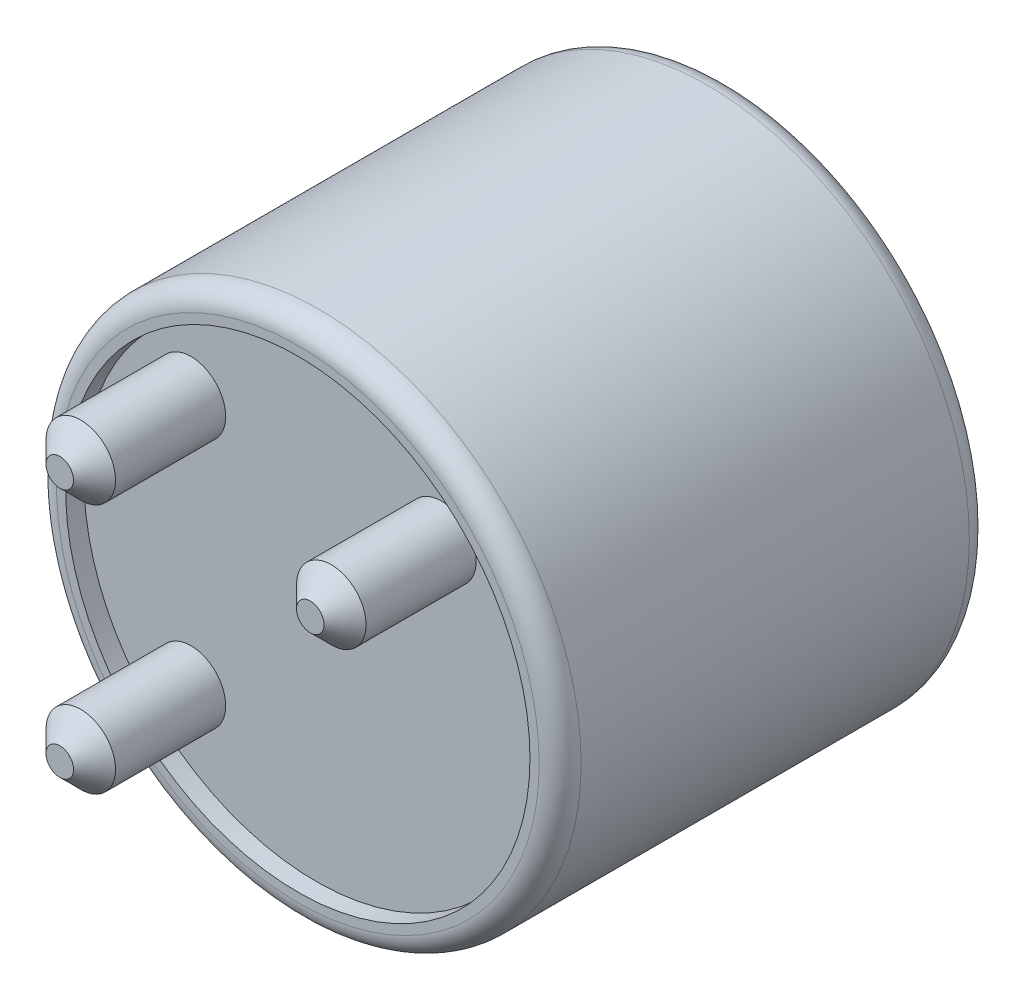
ISO-10303-21;
HEADER;
FILE_DESCRIPTION(('STEP AP214'),'2;1');
FILE_NAME('part.step','',(''),(''),'','','');
FILE_SCHEMA(('AUTOMOTIVE_DESIGN { 1 0 10303 214 1 1 1 1 }'));
ENDSEC;
DATA;
#1=APPLICATION_CONTEXT('core data for automotive mechanical design processes');
#2=APPLICATION_PROTOCOL_DEFINITION('international standard','automotive_design',2000,#1);
#3=PRODUCT_CONTEXT('',#1,'mechanical');
#4=PRODUCT('Part','Part','',(#3));
#5=PRODUCT_RELATED_PRODUCT_CATEGORY('part','',(#4));
#6=PRODUCT_DEFINITION_FORMATION('','',#4);
#7=PRODUCT_DEFINITION_CONTEXT('part definition',#1,'design');
#8=PRODUCT_DEFINITION('design','',#6,#7);
#9=PRODUCT_DEFINITION_SHAPE('','',#8);
#10=(LENGTH_UNIT() NAMED_UNIT(*) SI_UNIT(.MILLI.,.METRE.));
#11=(NAMED_UNIT(*) PLANE_ANGLE_UNIT() SI_UNIT($,.RADIAN.));
#12=(NAMED_UNIT(*) SI_UNIT($,.STERADIAN.) SOLID_ANGLE_UNIT());
#13=UNCERTAINTY_MEASURE_WITH_UNIT(LENGTH_MEASURE(1.E-05),#10,'distance_accuracy_value','');
#14=(GEOMETRIC_REPRESENTATION_CONTEXT(3) GLOBAL_UNCERTAINTY_ASSIGNED_CONTEXT((#13)) GLOBAL_UNIT_ASSIGNED_CONTEXT((#10,
#11,#12)) REPRESENTATION_CONTEXT('',''));
#15=CARTESIAN_POINT('',(0.,0.,0.));
#16=DIRECTION('',(0.,0.,1.));
#17=DIRECTION('',(1.,0.,0.));
#18=AXIS2_PLACEMENT_3D('',#15,#16,#17);
#19=CARTESIAN_POINT('',(0.,0.,16.4));
#20=DIRECTION('',(0.,0.,-1.));
#21=DIRECTION('',(-1.,0.,0.));
#22=AXIS2_PLACEMENT_3D('',#19,#20,#21);
#23=CYLINDRICAL_SURFACE('',#22,10.);
#24=CARTESIAN_POINT('',(0.,0.,0.8));
#25=DIRECTION('',(0.,0.,1.));
#26=DIRECTION('',(1.,0.,0.));
#27=AXIS2_PLACEMENT_3D('',#24,#25,#26);
#28=CIRCLE('',#27,10.);
#29=CARTESIAN_POINT('',(10.,0.,0.8));
#30=VERTEX_POINT('',#29);
#31=EDGE_CURVE('E64',#30,#30,#28,.T.);
#32=ORIENTED_EDGE('',*,*,#31,.T.);
#33=EDGE_LOOP('',(#32));
#34=FACE_BOUND('',#33,.T.);
#35=CARTESIAN_POINT('',(0.,0.,15.6));
#36=DIRECTION('',(0.,0.,1.));
#37=DIRECTION('',(1.,0.,0.));
#38=AXIS2_PLACEMENT_3D('',#35,#36,#37);
#39=CIRCLE('',#38,10.);
#40=CARTESIAN_POINT('',(10.,0.,15.6));
#41=VERTEX_POINT('',#40);
#42=EDGE_CURVE('E70',#41,#41,#39,.F.);
#43=ORIENTED_EDGE('',*,*,#42,.T.);
#44=EDGE_LOOP('',(#43));
#45=FACE_BOUND('',#44,.T.);
#46=ADVANCED_FACE('F49',(#34,#45),#23,.T.);
#47=CARTESIAN_POINT('',(0.,0.,16.4));
#48=DIRECTION('',(0.,0.,1.));
#49=DIRECTION('',(1.,0.,0.));
#50=AXIS2_PLACEMENT_3D('',#47,#48,#49);
#51=PLANE('',#50);
#52=CARTESIAN_POINT('',(0.,0.,16.4));
#53=DIRECTION('',(0.,0.,1.));
#54=DIRECTION('',(1.,0.,0.));
#55=AXIS2_PLACEMENT_3D('',#52,#53,#54);
#56=CIRCLE('',#55,9.2);
#57=CARTESIAN_POINT('',(9.2,0.,16.4));
#58=VERTEX_POINT('',#57);
#59=EDGE_CURVE('E10',#58,#58,#56,.T.);
#60=ORIENTED_EDGE('',*,*,#59,.T.);
#61=EDGE_LOOP('',(#60));
#62=FACE_BOUND('',#61,.T.);
#63=CARTESIAN_POINT('',(0.,0.,16.4));
#64=DIRECTION('',(0.,0.,1.));
#65=DIRECTION('',(1.,0.,0.));
#66=AXIS2_PLACEMENT_3D('',#63,#64,#65);
#67=CIRCLE('',#66,8.85);
#68=CARTESIAN_POINT('',(8.85,0.,16.4));
#69=VERTEX_POINT('',#68);
#70=EDGE_CURVE('E101',#69,#69,#67,.T.);
#71=ORIENTED_EDGE('',*,*,#70,.F.);
#72=EDGE_LOOP('',(#71));
#73=FACE_BOUND('',#72,.T.);
#74=ADVANCED_FACE('F161',(#62,#73),#51,.T.);
#75=CARTESIAN_POINT('',(0.,0.,0.));
#76=DIRECTION('',(0.,0.,1.));
#77=DIRECTION('',(1.,0.,0.));
#78=AXIS2_PLACEMENT_3D('',#75,#76,#77);
#79=PLANE('',#78);
#80=CARTESIAN_POINT('',(0.,0.,0.));
#81=DIRECTION('',(0.,0.,1.));
#82=DIRECTION('',(1.,0.,0.));
#83=AXIS2_PLACEMENT_3D('',#80,#81,#82);
#84=CIRCLE('',#83,9.2);
#85=CARTESIAN_POINT('',(9.2,0.,0.));
#86=VERTEX_POINT('',#85);
#87=EDGE_CURVE('E57',#86,#86,#84,.F.);
#88=ORIENTED_EDGE('',*,*,#87,.T.);
#89=EDGE_LOOP('',(#88));
#90=FACE_BOUND('',#89,.T.);
#91=CARTESIAN_POINT('',(0.,0.,0.));
#92=DIRECTION('',(0.,0.,-1.));
#93=DIRECTION('',(-1.,0.,0.));
#94=AXIS2_PLACEMENT_3D('',#91,#92,#93);
#95=CIRCLE('',#94,8.05);
#96=CARTESIAN_POINT('',(-8.05,0.,0.));
#97=VERTEX_POINT('',#96);
#98=EDGE_CURVE('E120',#97,#97,#95,.T.);
#99=ORIENTED_EDGE('',*,*,#98,.F.);
#100=EDGE_LOOP('',(#99));
#101=FACE_BOUND('',#100,.T.);
#102=ADVANCED_FACE('F158',(#90,#101),#79,.F.);
#103=CARTESIAN_POINT('',(0.,0.,15.7));
#104=DIRECTION('',(0.,0.,1.));
#105=DIRECTION('',(1.,0.,0.));
#106=AXIS2_PLACEMENT_3D('',#103,#104,#105);
#107=CYLINDRICAL_SURFACE('',#106,8.85);
#108=CARTESIAN_POINT('',(0.,0.,15.7));
#109=DIRECTION('',(0.,0.,1.));
#110=DIRECTION('',(1.,0.,0.));
#111=AXIS2_PLACEMENT_3D('',#108,#109,#110);
#112=CIRCLE('',#111,8.85);
#113=CARTESIAN_POINT('',(8.85,0.,15.7));
#114=VERTEX_POINT('',#113);
#115=EDGE_CURVE('E100',#114,#114,#112,.T.);
#116=ORIENTED_EDGE('',*,*,#115,.F.);
#117=EDGE_LOOP('',(#116));
#118=FACE_BOUND('',#117,.T.);
#119=ORIENTED_EDGE('',*,*,#70,.T.);
#120=EDGE_LOOP('',(#119));
#121=FACE_BOUND('',#120,.T.);
#122=ADVANCED_FACE('F160',(#118,#121),#107,.F.);
#123=CARTESIAN_POINT('',(0.,0.,15.7));
#124=DIRECTION('',(0.,0.,1.));
#125=DIRECTION('',(1.,0.,0.));
#126=AXIS2_PLACEMENT_3D('',#123,#124,#125);
#127=PLANE('',#126);
#128=CARTESIAN_POINT('',(4.775,4.775,15.7));
#129=DIRECTION('',(0.,0.,1.));
#130=DIRECTION('',(1.,0.,0.));
#131=AXIS2_PLACEMENT_3D('',#128,#129,#130);
#132=CIRCLE('',#131,1.325);
#133=CARTESIAN_POINT('',(6.1,4.775,15.7));
#134=VERTEX_POINT('',#133);
#135=EDGE_CURVE('E115',#134,#134,#132,.T.);
#136=ORIENTED_EDGE('',*,*,#135,.F.);
#137=EDGE_LOOP('',(#136));
#138=FACE_BOUND('',#137,.T.);
#139=CARTESIAN_POINT('',(-4.775,-4.775,15.7));
#140=DIRECTION('',(0.,0.,1.));
#141=DIRECTION('',(1.,0.,0.));
#142=AXIS2_PLACEMENT_3D('',#139,#140,#141);
#143=CIRCLE('',#142,1.325);
#144=CARTESIAN_POINT('',(-3.45,-4.775,15.7));
#145=VERTEX_POINT('',#144);
#146=EDGE_CURVE('E112',#145,#145,#143,.T.);
#147=ORIENTED_EDGE('',*,*,#146,.F.);
#148=EDGE_LOOP('',(#147));
#149=FACE_BOUND('',#148,.T.);
#150=CARTESIAN_POINT('',(-4.775,4.775,15.7));
#151=DIRECTION('',(0.,0.,1.));
#152=DIRECTION('',(1.,0.,0.));
#153=AXIS2_PLACEMENT_3D('',#150,#151,#152);
#154=CIRCLE('',#153,1.325);
#155=CARTESIAN_POINT('',(-3.45,4.775,15.7));
#156=VERTEX_POINT('',#155);
#157=EDGE_CURVE('E105',#156,#156,#154,.T.);
#158=ORIENTED_EDGE('',*,*,#157,.F.);
#159=EDGE_LOOP('',(#158));
#160=FACE_BOUND('',#159,.T.);
#161=ORIENTED_EDGE('',*,*,#115,.T.);
#162=EDGE_LOOP('',(#161));
#163=FACE_BOUND('',#162,.T.);
#164=ADVANCED_FACE('F166',(#138,#149,#160,#163),#127,.T.);
#165=CARTESIAN_POINT('',(-4.775,4.775,20.7));
#166=DIRECTION('',(0.,0.,-1.));
#167=DIRECTION('',(-1.,0.,0.));
#168=AXIS2_PLACEMENT_3D('',#165,#166,#167);
#169=CYLINDRICAL_SURFACE('',#168,1.325);
#170=CARTESIAN_POINT('',(-4.775,4.775,19.9));
#171=DIRECTION('',(0.,0.,1.));
#172=DIRECTION('',(1.,0.,0.));
#173=AXIS2_PLACEMENT_3D('',#170,#171,#172);
#174=CIRCLE('',#173,1.325);
#175=CARTESIAN_POINT('',(-3.45,4.775,19.9));
#176=VERTEX_POINT('',#175);
#177=EDGE_CURVE('E76',#176,#176,#174,.F.);
#178=ORIENTED_EDGE('',*,*,#177,.T.);
#179=EDGE_LOOP('',(#178));
#180=FACE_BOUND('',#179,.T.);
#181=ORIENTED_EDGE('',*,*,#157,.T.);
#182=EDGE_LOOP('',(#181));
#183=FACE_BOUND('',#182,.T.);
#184=ADVANCED_FACE('F226',(#180,#183),#169,.T.);
#185=CARTESIAN_POINT('',(-4.775,4.775,20.7));
#186=DIRECTION('',(0.,0.,1.));
#187=DIRECTION('',(1.,0.,0.));
#188=AXIS2_PLACEMENT_3D('',#185,#186,#187);
#189=PLANE('',#188);
#190=CARTESIAN_POINT('',(-4.775,4.775,20.7));
#191=DIRECTION('',(0.,0.,1.));
#192=DIRECTION('',(1.,0.,0.));
#193=AXIS2_PLACEMENT_3D('',#190,#191,#192);
#194=CIRCLE('',#193,0.525000000000001);
#195=CARTESIAN_POINT('',(-4.25,4.775,20.7));
#196=VERTEX_POINT('',#195);
#197=EDGE_CURVE('E80',#196,#196,#194,.T.);
#198=ORIENTED_EDGE('',*,*,#197,.T.);
#199=EDGE_LOOP('',(#198));
#200=FACE_BOUND('',#199,.T.);
#201=ADVANCED_FACE('F219',(#200),#189,.T.);
#202=CARTESIAN_POINT('',(-4.775,-4.775,20.7));
#203=DIRECTION('',(0.,0.,-1.));
#204=DIRECTION('',(-1.,0.,0.));
#205=AXIS2_PLACEMENT_3D('',#202,#203,#204);
#206=CYLINDRICAL_SURFACE('',#205,1.325);
#207=CARTESIAN_POINT('',(-4.775,-4.775,19.9));
#208=DIRECTION('',(0.,0.,1.));
#209=DIRECTION('',(1.,0.,0.));
#210=AXIS2_PLACEMENT_3D('',#207,#208,#209);
#211=CIRCLE('',#210,1.325);
#212=CARTESIAN_POINT('',(-3.45,-4.775,19.9));
#213=VERTEX_POINT('',#212);
#214=EDGE_CURVE('E84',#213,#213,#211,.F.);
#215=ORIENTED_EDGE('',*,*,#214,.T.);
#216=EDGE_LOOP('',(#215));
#217=FACE_BOUND('',#216,.T.);
#218=ORIENTED_EDGE('',*,*,#146,.T.);
#219=EDGE_LOOP('',(#218));
#220=FACE_BOUND('',#219,.T.);
#221=ADVANCED_FACE('F216',(#217,#220),#206,.T.);
#222=CARTESIAN_POINT('',(-4.775,-4.775,20.7));
#223=DIRECTION('',(0.,0.,1.));
#224=DIRECTION('',(1.,0.,0.));
#225=AXIS2_PLACEMENT_3D('',#222,#223,#224);
#226=PLANE('',#225);
#227=CARTESIAN_POINT('',(-4.775,-4.775,20.7));
#228=DIRECTION('',(0.,0.,1.));
#229=DIRECTION('',(1.,0.,0.));
#230=AXIS2_PLACEMENT_3D('',#227,#228,#229);
#231=CIRCLE('',#230,0.525000000000001);
#232=CARTESIAN_POINT('',(-4.25,-4.775,20.7));
#233=VERTEX_POINT('',#232);
#234=EDGE_CURVE('E88',#233,#233,#231,.T.);
#235=ORIENTED_EDGE('',*,*,#234,.T.);
#236=EDGE_LOOP('',(#235));
#237=FACE_BOUND('',#236,.T.);
#238=ADVANCED_FACE('F211',(#237),#226,.T.);
#239=CARTESIAN_POINT('',(4.775,4.775,20.7));
#240=DIRECTION('',(0.,0.,-1.));
#241=DIRECTION('',(-1.,0.,0.));
#242=AXIS2_PLACEMENT_3D('',#239,#240,#241);
#243=CYLINDRICAL_SURFACE('',#242,1.325);
#244=CARTESIAN_POINT('',(4.775,4.775,19.9));
#245=DIRECTION('',(0.,0.,1.));
#246=DIRECTION('',(1.,0.,0.));
#247=AXIS2_PLACEMENT_3D('',#244,#245,#246);
#248=CIRCLE('',#247,1.325);
#249=CARTESIAN_POINT('',(6.1,4.775,19.9));
#250=VERTEX_POINT('',#249);
#251=EDGE_CURVE('E92',#250,#250,#248,.F.);
#252=ORIENTED_EDGE('',*,*,#251,.T.);
#253=EDGE_LOOP('',(#252));
#254=FACE_BOUND('',#253,.T.);
#255=ORIENTED_EDGE('',*,*,#135,.T.);
#256=EDGE_LOOP('',(#255));
#257=FACE_BOUND('',#256,.T.);
#258=ADVANCED_FACE('F208',(#254,#257),#243,.T.);
#259=CARTESIAN_POINT('',(4.775,4.775,20.7));
#260=DIRECTION('',(0.,0.,1.));
#261=DIRECTION('',(1.,0.,0.));
#262=AXIS2_PLACEMENT_3D('',#259,#260,#261);
#263=PLANE('',#262);
#264=CARTESIAN_POINT('',(4.775,4.775,20.7));
#265=DIRECTION('',(0.,0.,1.));
#266=DIRECTION('',(1.,0.,0.));
#267=AXIS2_PLACEMENT_3D('',#264,#265,#266);
#268=CIRCLE('',#267,0.525000000000001);
#269=CARTESIAN_POINT('',(5.3,4.775,20.7));
#270=VERTEX_POINT('',#269);
#271=EDGE_CURVE('E96',#270,#270,#268,.T.);
#272=ORIENTED_EDGE('',*,*,#271,.T.);
#273=EDGE_LOOP('',(#272));
#274=FACE_BOUND('',#273,.T.);
#275=ADVANCED_FACE('F184',(#274),#263,.T.);
#276=CARTESIAN_POINT('',(4.775,4.775,20.7));
#277=DIRECTION('',(0.,0.,-1.));
#278=DIRECTION('',(-1.,0.,0.));
#279=AXIS2_PLACEMENT_3D('',#276,#277,#278);
#280=CONICAL_SURFACE('',#279,0.525000000000001,0.785398163397446);
#281=ORIENTED_EDGE('',*,*,#251,.F.);
#282=EDGE_LOOP('',(#281));
#283=FACE_BOUND('',#282,.T.);
#284=ORIENTED_EDGE('',*,*,#271,.F.);
#285=EDGE_LOOP('',(#284));
#286=FACE_BOUND('',#285,.T.);
#287=ADVANCED_FACE('F177',(#283,#286),#280,.T.);
#288=CARTESIAN_POINT('',(-4.775,-4.775,20.7));
#289=DIRECTION('',(0.,0.,-1.));
#290=DIRECTION('',(-1.,0.,0.));
#291=AXIS2_PLACEMENT_3D('',#288,#289,#290);
#292=CONICAL_SURFACE('',#291,0.525000000000001,0.785398163397446);
#293=ORIENTED_EDGE('',*,*,#214,.F.);
#294=EDGE_LOOP('',(#293));
#295=FACE_BOUND('',#294,.T.);
#296=ORIENTED_EDGE('',*,*,#234,.F.);
#297=EDGE_LOOP('',(#296));
#298=FACE_BOUND('',#297,.T.);
#299=ADVANCED_FACE('F183',(#295,#298),#292,.T.);
#300=CARTESIAN_POINT('',(-4.775,4.775,20.7));
#301=DIRECTION('',(0.,0.,-1.));
#302=DIRECTION('',(-1.,0.,0.));
#303=AXIS2_PLACEMENT_3D('',#300,#301,#302);
#304=CONICAL_SURFACE('',#303,0.525000000000001,0.785398163397446);
#305=ORIENTED_EDGE('',*,*,#177,.F.);
#306=EDGE_LOOP('',(#305));
#307=FACE_BOUND('',#306,.T.);
#308=ORIENTED_EDGE('',*,*,#197,.F.);
#309=EDGE_LOOP('',(#308));
#310=FACE_BOUND('',#309,.T.);
#311=ADVANCED_FACE('F154',(#307,#310),#304,.T.);
#312=CARTESIAN_POINT('',(0.,0.,1.5));
#313=DIRECTION('',(0.,0.,-1.));
#314=DIRECTION('',(-1.,0.,0.));
#315=AXIS2_PLACEMENT_3D('',#312,#313,#314);
#316=CYLINDRICAL_SURFACE('',#315,8.05);
#317=CARTESIAN_POINT('',(0.,0.,1.5));
#318=DIRECTION('',(0.,0.,-1.));
#319=DIRECTION('',(-1.,0.,0.));
#320=AXIS2_PLACEMENT_3D('',#317,#318,#319);
#321=CIRCLE('',#320,8.05);
#322=CARTESIAN_POINT('',(-8.05,0.,1.5));
#323=VERTEX_POINT('',#322);
#324=EDGE_CURVE('E119',#323,#323,#321,.T.);
#325=ORIENTED_EDGE('',*,*,#324,.F.);
#326=EDGE_LOOP('',(#325));
#327=FACE_BOUND('',#326,.T.);
#328=ORIENTED_EDGE('',*,*,#98,.T.);
#329=EDGE_LOOP('',(#328));
#330=FACE_BOUND('',#329,.T.);
#331=ADVANCED_FACE('F148',(#327,#330),#316,.F.);
#332=CARTESIAN_POINT('',(0.,0.,1.5));
#333=DIRECTION('',(0.,0.,-1.));
#334=DIRECTION('',(-1.,0.,0.));
#335=AXIS2_PLACEMENT_3D('',#332,#333,#334);
#336=PLANE('',#335);
#337=CARTESIAN_POINT('',(0.,0.,1.5));
#338=DIRECTION('',(0.,0.,-1.));
#339=DIRECTION('',(-1.,0.,0.));
#340=AXIS2_PLACEMENT_3D('',#337,#338,#339);
#341=CIRCLE('',#340,0.6);
#342=CARTESIAN_POINT('',(-0.6,0.,1.5));
#343=VERTEX_POINT('',#342);
#344=EDGE_CURVE('E128',#343,#343,#341,.T.);
#345=ORIENTED_EDGE('',*,*,#344,.F.);
#346=EDGE_LOOP('',(#345));
#347=FACE_BOUND('',#346,.T.);
#348=ORIENTED_EDGE('',*,*,#324,.T.);
#349=EDGE_LOOP('',(#348));
#350=FACE_BOUND('',#349,.T.);
#351=ADVANCED_FACE('F142',(#347,#350),#336,.T.);
#352=CARTESIAN_POINT('',(0.,0.,4.5));
#353=DIRECTION('',(0.,0.,-1.));
#354=DIRECTION('',(-1.,0.,0.));
#355=AXIS2_PLACEMENT_3D('',#352,#353,#354);
#356=CYLINDRICAL_SURFACE('',#355,0.6);
#357=CARTESIAN_POINT('',(0.,0.,4.5));
#358=DIRECTION('',(0.,0.,-1.));
#359=DIRECTION('',(-1.,0.,0.));
#360=AXIS2_PLACEMENT_3D('',#357,#358,#359);
#361=CIRCLE('',#360,0.6);
#362=CARTESIAN_POINT('',(-0.6,0.,4.5));
#363=VERTEX_POINT('',#362);
#364=EDGE_CURVE('E124',#363,#363,#361,.T.);
#365=ORIENTED_EDGE('',*,*,#364,.F.);
#366=EDGE_LOOP('',(#365));
#367=FACE_BOUND('',#366,.T.);
#368=ORIENTED_EDGE('',*,*,#344,.T.);
#369=EDGE_LOOP('',(#368));
#370=FACE_BOUND('',#369,.T.);
#371=ADVANCED_FACE('F139',(#367,#370),#356,.F.);
#372=CARTESIAN_POINT('',(0.,0.,4.5));
#373=DIRECTION('',(0.,0.,-1.));
#374=DIRECTION('',(-1.,0.,0.));
#375=AXIS2_PLACEMENT_3D('',#372,#373,#374);
#376=PLANE('',#375);
#377=ORIENTED_EDGE('',*,*,#364,.T.);
#378=EDGE_LOOP('',(#377));
#379=FACE_BOUND('',#378,.T.);
#380=ADVANCED_FACE('F137',(#379),#376,.T.);
#381=CARTESIAN_POINT('',(0.,0.,0.8));
#382=DIRECTION('',(0.,0.,1.));
#383=DIRECTION('',(1.,0.,0.));
#384=AXIS2_PLACEMENT_3D('',#381,#382,#383);
#385=TOROIDAL_SURFACE('',#384,9.2,0.8);
#386=ORIENTED_EDGE('',*,*,#87,.F.);
#387=EDGE_LOOP('',(#386));
#388=FACE_BOUND('',#387,.T.);
#389=ORIENTED_EDGE('',*,*,#31,.F.);
#390=EDGE_LOOP('',(#389));
#391=FACE_BOUND('',#390,.T.);
#392=ADVANCED_FACE('F196',(#388,#391),#385,.T.);
#393=CARTESIAN_POINT('',(0.,0.,15.6));
#394=DIRECTION('',(0.,0.,1.));
#395=DIRECTION('',(1.,0.,0.));
#396=AXIS2_PLACEMENT_3D('',#393,#394,#395);
#397=TOROIDAL_SURFACE('',#396,9.2,0.8);
#398=ORIENTED_EDGE('',*,*,#42,.F.);
#399=EDGE_LOOP('',(#398));
#400=FACE_BOUND('',#399,.T.);
#401=ORIENTED_EDGE('',*,*,#59,.F.);
#402=EDGE_LOOP('',(#401));
#403=FACE_BOUND('',#402,.T.);
#404=ADVANCED_FACE('F51',(#400,#403),#397,.T.);
#405=CLOSED_SHELL('',(#46,#74,#102,#122,#164,#184,#201,#221,#238,#258,#275,#287,#299,#311,#331,
#351,#371,#380,#392,#404));
#406=MANIFOLD_SOLID_BREP('B2',#405);
#407=ADVANCED_BREP_SHAPE_REPRESENTATION('',(#18,#406),#14);
#408=SHAPE_DEFINITION_REPRESENTATION(#9,#407);
ENDSEC;
END-ISO-10303-21;
